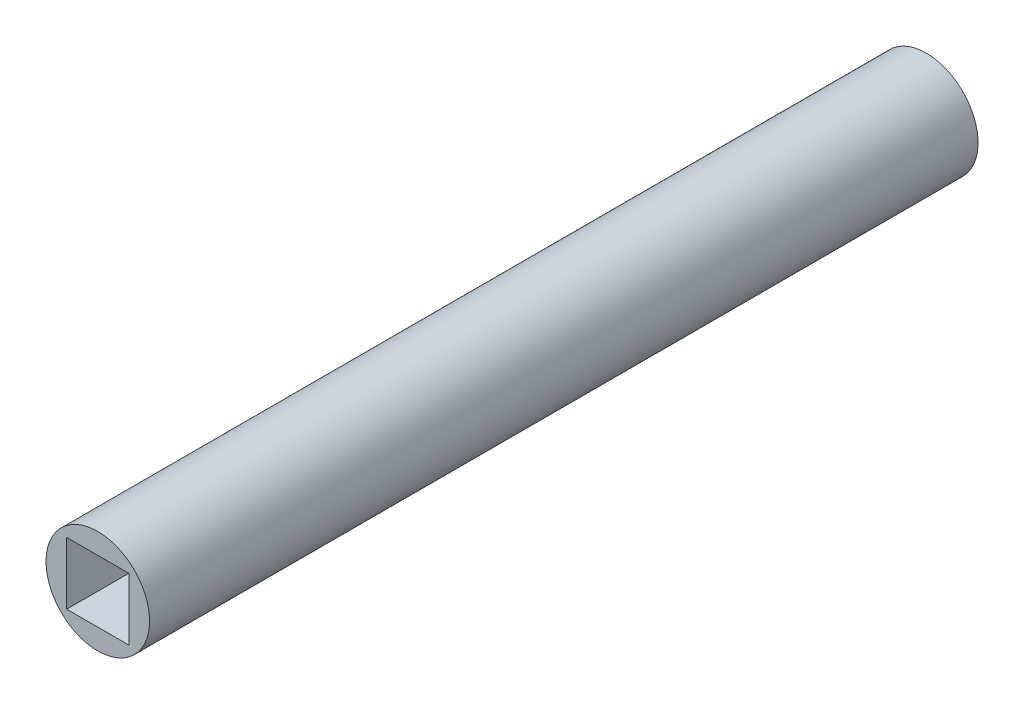
ISO-10303-21;
HEADER;
FILE_DESCRIPTION(('STEP AP214'),'2;1');
FILE_NAME('part.step','',(''),(''),'','','');
FILE_SCHEMA(('AUTOMOTIVE_DESIGN { 1 0 10303 214 1 1 1 1 }'));
ENDSEC;
DATA;
#1=APPLICATION_CONTEXT('core data for automotive mechanical design processes');
#2=APPLICATION_PROTOCOL_DEFINITION('international standard','automotive_design',2000,#1);
#3=PRODUCT_CONTEXT('',#1,'mechanical');
#4=PRODUCT('Part','Part','',(#3));
#5=PRODUCT_RELATED_PRODUCT_CATEGORY('part','',(#4));
#6=PRODUCT_DEFINITION_FORMATION('','',#4);
#7=PRODUCT_DEFINITION_CONTEXT('part definition',#1,'design');
#8=PRODUCT_DEFINITION('design','',#6,#7);
#9=PRODUCT_DEFINITION_SHAPE('','',#8);
#10=(LENGTH_UNIT() NAMED_UNIT(*) SI_UNIT(.MILLI.,.METRE.));
#11=(NAMED_UNIT(*) PLANE_ANGLE_UNIT() SI_UNIT($,.RADIAN.));
#12=(NAMED_UNIT(*) SI_UNIT($,.STERADIAN.) SOLID_ANGLE_UNIT());
#13=UNCERTAINTY_MEASURE_WITH_UNIT(LENGTH_MEASURE(1.E-05),#10,'distance_accuracy_value','');
#14=(GEOMETRIC_REPRESENTATION_CONTEXT(3) GLOBAL_UNCERTAINTY_ASSIGNED_CONTEXT((#13)) GLOBAL_UNIT_ASSIGNED_CONTEXT((#10,
#11,#12)) REPRESENTATION_CONTEXT('',''));
#15=CARTESIAN_POINT('',(0.,0.,0.));
#16=DIRECTION('',(0.,0.,1.));
#17=DIRECTION('',(1.,0.,0.));
#18=AXIS2_PLACEMENT_3D('',#15,#16,#17);
#19=CARTESIAN_POINT('',(0.,0.,254.));
#20=DIRECTION('',(0.,0.,1.));
#21=DIRECTION('',(1.,0.,0.));
#22=AXIS2_PLACEMENT_3D('',#19,#20,#21);
#23=PLANE('',#22);
#24=DIRECTION('',(1.,0.,0.));
#25=VECTOR('',#24,1.);
#26=CARTESIAN_POINT('',(-9.52499999999997,-9.525,254.));
#27=LINE('',#26,#25);
#28=CARTESIAN_POINT('',(-9.52499999999997,-9.525,254.));
#29=VERTEX_POINT('',#28);
#30=CARTESIAN_POINT('',(9.52500000000003,-9.525,254.));
#31=VERTEX_POINT('',#30);
#32=EDGE_CURVE('E52',#29,#31,#27,.T.);
#33=ORIENTED_EDGE('',*,*,#32,.F.);
#34=DIRECTION('',(0.,-1.,0.));
#35=VECTOR('',#34,1.);
#36=CARTESIAN_POINT('',(-9.52499999999997,9.525,254.));
#37=LINE('',#36,#35);
#38=CARTESIAN_POINT('',(-9.52499999999997,9.525,254.));
#39=VERTEX_POINT('',#38);
#40=EDGE_CURVE('E96',#39,#29,#37,.T.);
#41=ORIENTED_EDGE('',*,*,#40,.F.);
#42=DIRECTION('',(1.,0.,0.));
#43=VECTOR('',#42,1.);
#44=CARTESIAN_POINT('',(-9.52499999999997,9.525,254.));
#45=LINE('',#44,#43);
#46=CARTESIAN_POINT('',(9.52500000000003,9.525,254.));
#47=VERTEX_POINT('',#46);
#48=EDGE_CURVE('E97',#39,#47,#45,.T.);
#49=ORIENTED_EDGE('',*,*,#48,.T.);
#50=DIRECTION('',(0.,-1.,0.));
#51=VECTOR('',#50,1.);
#52=CARTESIAN_POINT('',(9.52500000000003,9.525,254.));
#53=LINE('',#52,#51);
#54=EDGE_CURVE('E104',#47,#31,#53,.T.);
#55=ORIENTED_EDGE('',*,*,#54,.T.);
#56=EDGE_LOOP('',(#33,#41,#49,#55));
#57=FACE_BOUND('',#56,.T.);
#58=CARTESIAN_POINT('',(0.,0.,254.));
#59=DIRECTION('',(0.,0.,-1.));
#60=DIRECTION('',(-1.,0.,0.));
#61=AXIS2_PLACEMENT_3D('',#58,#59,#60);
#62=CIRCLE('',#61,15.875);
#63=CARTESIAN_POINT('',(-15.875,0.,254.));
#64=VERTEX_POINT('',#63);
#65=EDGE_CURVE('E11',#64,#64,#62,.T.);
#66=ORIENTED_EDGE('',*,*,#65,.F.);
#67=EDGE_LOOP('',(#66));
#68=FACE_BOUND('',#67,.T.);
#69=ADVANCED_FACE('F39',(#57,#68),#23,.T.);
#70=CARTESIAN_POINT('',(0.,0.,0.));
#71=DIRECTION('',(0.,0.,-1.));
#72=DIRECTION('',(-1.,0.,0.));
#73=AXIS2_PLACEMENT_3D('',#70,#71,#72);
#74=CYLINDRICAL_SURFACE('',#73,15.875);
#75=ORIENTED_EDGE('',*,*,#65,.T.);
#76=EDGE_LOOP('',(#75));
#77=FACE_BOUND('',#76,.T.);
#78=CARTESIAN_POINT('',(0.,0.,0.));
#79=DIRECTION('',(0.,0.,-1.));
#80=DIRECTION('',(-1.,0.,0.));
#81=AXIS2_PLACEMENT_3D('',#78,#79,#80);
#82=CIRCLE('',#81,15.875);
#83=CARTESIAN_POINT('',(-15.875,0.,0.));
#84=VERTEX_POINT('',#83);
#85=EDGE_CURVE('E46',#84,#84,#82,.T.);
#86=ORIENTED_EDGE('',*,*,#85,.F.);
#87=EDGE_LOOP('',(#86));
#88=FACE_BOUND('',#87,.T.);
#89=ADVANCED_FACE('F117',(#77,#88),#74,.T.);
#90=CARTESIAN_POINT('',(0.,0.,0.));
#91=DIRECTION('',(0.,0.,-1.));
#92=DIRECTION('',(-1.,0.,0.));
#93=AXIS2_PLACEMENT_3D('',#90,#91,#92);
#94=PLANE('',#93);
#95=DIRECTION('',(1.,0.,0.));
#96=VECTOR('',#95,1.);
#97=CARTESIAN_POINT('',(-9.52499999999997,-9.525,0.));
#98=LINE('',#97,#96);
#99=CARTESIAN_POINT('',(-9.52499999999997,-9.525,0.));
#100=VERTEX_POINT('',#99);
#101=CARTESIAN_POINT('',(9.52500000000003,-9.525,0.));
#102=VERTEX_POINT('',#101);
#103=EDGE_CURVE('E88',#100,#102,#98,.T.);
#104=ORIENTED_EDGE('',*,*,#103,.T.);
#105=DIRECTION('',(0.,-1.,0.));
#106=VECTOR('',#105,1.);
#107=CARTESIAN_POINT('',(9.52500000000003,9.525,0.));
#108=LINE('',#107,#106);
#109=CARTESIAN_POINT('',(9.52500000000003,9.525,0.));
#110=VERTEX_POINT('',#109);
#111=EDGE_CURVE('E79',#110,#102,#108,.T.);
#112=ORIENTED_EDGE('',*,*,#111,.F.);
#113=DIRECTION('',(1.,0.,0.));
#114=VECTOR('',#113,1.);
#115=CARTESIAN_POINT('',(-9.52499999999997,9.525,0.));
#116=LINE('',#115,#114);
#117=CARTESIAN_POINT('',(-9.52499999999997,9.525,0.));
#118=VERTEX_POINT('',#117);
#119=EDGE_CURVE('E84',#118,#110,#116,.T.);
#120=ORIENTED_EDGE('',*,*,#119,.F.);
#121=DIRECTION('',(0.,-1.,0.));
#122=VECTOR('',#121,1.);
#123=CARTESIAN_POINT('',(-9.52499999999997,9.525,0.));
#124=LINE('',#123,#122);
#125=EDGE_CURVE('E93',#118,#100,#124,.T.);
#126=ORIENTED_EDGE('',*,*,#125,.T.);
#127=EDGE_LOOP('',(#104,#112,#120,#126));
#128=FACE_BOUND('',#127,.T.);
#129=ORIENTED_EDGE('',*,*,#85,.T.);
#130=EDGE_LOOP('',(#129));
#131=FACE_BOUND('',#130,.T.);
#132=ADVANCED_FACE('F91',(#128,#131),#94,.T.);
#133=CARTESIAN_POINT('',(-9.52499999999997,-9.525,0.));
#134=DIRECTION('',(0.,-1.,0.));
#135=DIRECTION('',(0.,0.,-1.));
#136=AXIS2_PLACEMENT_3D('',#133,#134,#135);
#137=PLANE('',#136);
#138=ORIENTED_EDGE('',*,*,#32,.T.);
#139=DIRECTION('',(0.,0.,1.));
#140=VECTOR('',#139,1.);
#141=CARTESIAN_POINT('',(9.52500000000003,-9.525,0.));
#142=LINE('',#141,#140);
#143=EDGE_CURVE('E78',#102,#31,#142,.T.);
#144=ORIENTED_EDGE('',*,*,#143,.F.);
#145=ORIENTED_EDGE('',*,*,#103,.F.);
#146=DIRECTION('',(0.,0.,1.));
#147=VECTOR('',#146,1.);
#148=CARTESIAN_POINT('',(-9.52499999999997,-9.525,0.));
#149=LINE('',#148,#147);
#150=EDGE_CURVE('E108',#100,#29,#149,.T.);
#151=ORIENTED_EDGE('',*,*,#150,.T.);
#152=EDGE_LOOP('',(#138,#144,#145,#151));
#153=FACE_BOUND('',#152,.T.);
#154=ADVANCED_FACE('F90',(#153),#137,.F.);
#155=CARTESIAN_POINT('',(-9.52499999999997,9.525,0.));
#156=DIRECTION('',(-1.,0.,0.));
#157=DIRECTION('',(0.,-1.,0.));
#158=AXIS2_PLACEMENT_3D('',#155,#156,#157);
#159=PLANE('',#158);
#160=ORIENTED_EDGE('',*,*,#40,.T.);
#161=ORIENTED_EDGE('',*,*,#150,.F.);
#162=ORIENTED_EDGE('',*,*,#125,.F.);
#163=DIRECTION('',(0.,0.,1.));
#164=VECTOR('',#163,1.);
#165=CARTESIAN_POINT('',(-9.52499999999997,9.525,0.));
#166=LINE('',#165,#164);
#167=EDGE_CURVE('E112',#118,#39,#166,.T.);
#168=ORIENTED_EDGE('',*,*,#167,.T.);
#169=EDGE_LOOP('',(#160,#161,#162,#168));
#170=FACE_BOUND('',#169,.T.);
#171=ADVANCED_FACE('F126',(#170),#159,.F.);
#172=CARTESIAN_POINT('',(-9.52499999999997,9.525,0.));
#173=DIRECTION('',(0.,-1.,0.));
#174=DIRECTION('',(0.,0.,-1.));
#175=AXIS2_PLACEMENT_3D('',#172,#173,#174);
#176=PLANE('',#175);
#177=ORIENTED_EDGE('',*,*,#48,.F.);
#178=ORIENTED_EDGE('',*,*,#167,.F.);
#179=ORIENTED_EDGE('',*,*,#119,.T.);
#180=DIRECTION('',(0.,0.,1.));
#181=VECTOR('',#180,1.);
#182=CARTESIAN_POINT('',(9.52500000000003,9.525,0.));
#183=LINE('',#182,#181);
#184=EDGE_CURVE('E62',#110,#47,#183,.T.);
#185=ORIENTED_EDGE('',*,*,#184,.T.);
#186=EDGE_LOOP('',(#177,#178,#179,#185));
#187=FACE_BOUND('',#186,.T.);
#188=ADVANCED_FACE('F132',(#187),#176,.T.);
#189=CARTESIAN_POINT('',(9.52500000000003,9.525,0.));
#190=DIRECTION('',(-1.,0.,0.));
#191=DIRECTION('',(0.,0.,1.));
#192=AXIS2_PLACEMENT_3D('',#189,#190,#191);
#193=PLANE('',#192);
#194=ORIENTED_EDGE('',*,*,#54,.F.);
#195=ORIENTED_EDGE('',*,*,#184,.F.);
#196=ORIENTED_EDGE('',*,*,#111,.T.);
#197=ORIENTED_EDGE('',*,*,#143,.T.);
#198=EDGE_LOOP('',(#194,#195,#196,#197));
#199=FACE_BOUND('',#198,.T.);
#200=ADVANCED_FACE('F76',(#199),#193,.T.);
#201=CLOSED_SHELL('',(#69,#89,#132,#154,#171,#188,#200));
#202=MANIFOLD_SOLID_BREP('B2',#201);
#203=ADVANCED_BREP_SHAPE_REPRESENTATION('',(#18,#202),#14);
#204=SHAPE_DEFINITION_REPRESENTATION(#9,#203);
ENDSEC;
END-ISO-10303-21;
